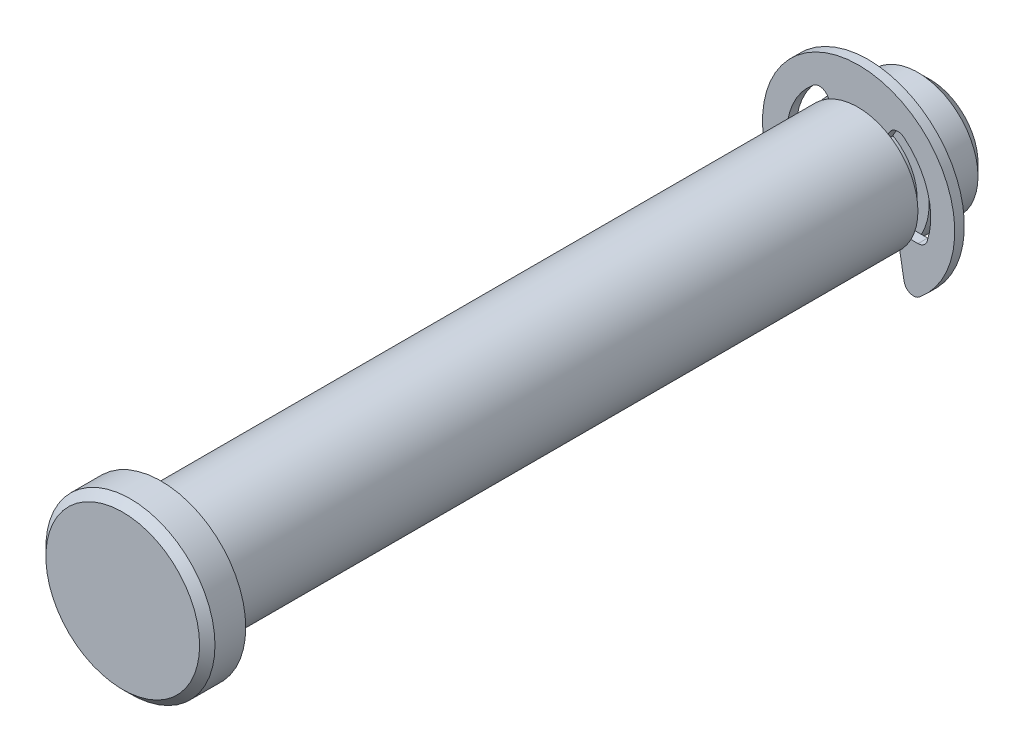
ISO-10303-21;
HEADER;
FILE_DESCRIPTION(('STEP AP214'),'2;1');
FILE_NAME('part.step','',(''),(''),'','','');
FILE_SCHEMA(('AUTOMOTIVE_DESIGN { 1 0 10303 214 1 1 1 1 }'));
ENDSEC;
DATA;
#1=APPLICATION_CONTEXT('core data for automotive mechanical design processes');
#2=APPLICATION_PROTOCOL_DEFINITION('international standard','automotive_design',2000,#1);
#3=PRODUCT_CONTEXT('',#1,'mechanical');
#4=PRODUCT('Part','Part','',(#3));
#5=PRODUCT_RELATED_PRODUCT_CATEGORY('part','',(#4));
#6=PRODUCT_DEFINITION_FORMATION('','',#4);
#7=PRODUCT_DEFINITION_CONTEXT('part definition',#1,'design');
#8=PRODUCT_DEFINITION('design','',#6,#7);
#9=PRODUCT_DEFINITION_SHAPE('','',#8);
#10=(LENGTH_UNIT() NAMED_UNIT(*) SI_UNIT(.MILLI.,.METRE.));
#11=(NAMED_UNIT(*) PLANE_ANGLE_UNIT() SI_UNIT($,.RADIAN.));
#12=(NAMED_UNIT(*) SI_UNIT($,.STERADIAN.) SOLID_ANGLE_UNIT());
#13=UNCERTAINTY_MEASURE_WITH_UNIT(LENGTH_MEASURE(1.E-05),#10,'distance_accuracy_value','');
#14=(GEOMETRIC_REPRESENTATION_CONTEXT(3) GLOBAL_UNCERTAINTY_ASSIGNED_CONTEXT((#13)) GLOBAL_UNIT_ASSIGNED_CONTEXT((#10,
#11,#12)) REPRESENTATION_CONTEXT('',''));
#15=CARTESIAN_POINT('',(0.,0.,0.));
#16=DIRECTION('',(0.,0.,1.));
#17=DIRECTION('',(1.,0.,0.));
#18=AXIS2_PLACEMENT_3D('',#15,#16,#17);
#19=CARTESIAN_POINT('',(0.,0.,-20.6883));
#20=DIRECTION('',(0.,0.,1.));
#21=DIRECTION('',(1.,0.,0.));
#22=AXIS2_PLACEMENT_3D('',#19,#20,#21);
#23=PLANE('',#22);
#24=DIRECTION('',(-0.173648177666931,0.984807753012208,0.));
#25=VECTOR('',#24,1.);
#26=CARTESIAN_POINT('',(2.1376354418804,0.376922803322178,-20.6883));
#27=LINE('',#26,#25);
#28=CARTESIAN_POINT('',(3.00221796143766,-4.52636832140214,-20.6883));
#29=VERTEX_POINT('',#28);
#30=CARTESIAN_POINT('',(2.54,-1.905,-20.6883));
#31=VERTEX_POINT('',#30);
#32=EDGE_CURVE('E200',#29,#31,#27,.T.);
#33=ORIENTED_EDGE('',*,*,#32,.F.);
#34=CARTESIAN_POINT('',(3.62757088460041,-4.41610172858364,-20.6883));
#35=DIRECTION('',(0.,0.,1.));
#36=DIRECTION('',(1.,0.,0.));
#37=AXIS2_PLACEMENT_3D('',#34,#35,#36);
#38=CIRCLE('',#37,0.635);
#39=CARTESIAN_POINT('',(4.03063431622268,-4.90677969842626,-20.6883));
#40=VERTEX_POINT('',#39);
#41=EDGE_CURVE('E254',#29,#40,#38,.T.);
#42=ORIENTED_EDGE('',*,*,#41,.T.);
#43=CARTESIAN_POINT('',(0.,0.,-20.6883));
#44=DIRECTION('',(0.,0.,1.));
#45=DIRECTION('',(1.,0.,0.));
#46=AXIS2_PLACEMENT_3D('',#43,#44,#45);
#47=CIRCLE('',#46,6.35);
#48=CARTESIAN_POINT('',(-4.03063431622268,-4.90677969842626,-20.6883));
#49=VERTEX_POINT('',#48);
#50=EDGE_CURVE('E180',#40,#49,#47,.T.);
#51=ORIENTED_EDGE('',*,*,#50,.T.);
#52=CARTESIAN_POINT('',(-3.62757088460041,-4.41610172858364,-20.6883));
#53=DIRECTION('',(0.,0.,1.));
#54=DIRECTION('',(1.,0.,0.));
#55=AXIS2_PLACEMENT_3D('',#52,#53,#54);
#56=CIRCLE('',#55,0.635);
#57=CARTESIAN_POINT('',(-3.00221796143766,-4.52636832140214,-20.6883));
#58=VERTEX_POINT('',#57);
#59=EDGE_CURVE('E252',#49,#58,#56,.T.);
#60=ORIENTED_EDGE('',*,*,#59,.T.);
#61=DIRECTION('',(-0.173648177666931,-0.984807753012208,0.));
#62=VECTOR('',#61,1.);
#63=CARTESIAN_POINT('',(-2.1376354418804,0.376922803322178,-20.6883));
#64=LINE('',#63,#62);
#65=CARTESIAN_POINT('',(-2.54,-1.905,-20.6883));
#66=VERTEX_POINT('',#65);
#67=EDGE_CURVE('E196',#66,#58,#64,.T.);
#68=ORIENTED_EDGE('',*,*,#67,.F.);
#69=DIRECTION('',(1.,0.,0.));
#70=VECTOR('',#69,1.);
#71=CARTESIAN_POINT('',(0.,-1.905,-20.6883));
#72=LINE('',#71,#70);
#73=CARTESIAN_POINT('',(-3.92725810840082,-1.905,-20.6883));
#74=VERTEX_POINT('',#73);
#75=EDGE_CURVE('E187',#74,#66,#72,.T.);
#76=ORIENTED_EDGE('',*,*,#75,.F.);
#77=CARTESIAN_POINT('',(-3.92725810840082,-1.27,-20.6883));
#78=DIRECTION('',(0.,0.,1.));
#79=DIRECTION('',(1.,0.,0.));
#80=AXIS2_PLACEMENT_3D('',#77,#78,#79);
#81=CIRCLE('',#80,0.635);
#82=CARTESIAN_POINT('',(-4.53145166353941,-1.46538461538462,-20.6883));
#83=VERTEX_POINT('',#82);
#84=EDGE_CURVE('E52',#74,#83,#81,.F.);
#85=ORIENTED_EDGE('',*,*,#84,.T.);
#86=CARTESIAN_POINT('',(0.,0.,-20.6883));
#87=DIRECTION('',(0.,0.,1.));
#88=DIRECTION('',(1.,0.,0.));
#89=AXIS2_PLACEMENT_3D('',#86,#87,#88);
#90=CIRCLE('',#89,4.7625);
#91=CARTESIAN_POINT('',(-2.98743092684563,3.70899753401458,-20.6883));
#92=VERTEX_POINT('',#91);
#93=EDGE_CURVE('E212',#92,#83,#90,.T.);
#94=ORIENTED_EDGE('',*,*,#93,.F.);
#95=CARTESIAN_POINT('',(-2.58910680326621,3.2144645294793,-20.6883));
#96=DIRECTION('',(0.,0.,1.));
#97=DIRECTION('',(1.,0.,0.));
#98=AXIS2_PLACEMENT_3D('',#95,#96,#97);
#99=CIRCLE('',#98,0.635);
#100=CARTESIAN_POINT('',(-2.0391806718631,3.53196452947931,-20.6883));
#101=VERTEX_POINT('',#100);
#102=EDGE_CURVE('E184',#92,#101,#99,.F.);
#103=ORIENTED_EDGE('',*,*,#102,.T.);
#104=DIRECTION('',(-0.500000000000002,0.866025403784438,0.));
#105=VECTOR('',#104,1.);
#106=CARTESIAN_POINT('',(0.,0.,-20.6883));
#107=LINE('',#106,#105);
#108=CARTESIAN_POINT('',(-1.5875,2.74963065701559,-20.6883));
#109=VERTEX_POINT('',#108);
#110=EDGE_CURVE('E176',#109,#101,#107,.T.);
#111=ORIENTED_EDGE('',*,*,#110,.F.);
#112=DIRECTION('',(1.,0.,0.));
#113=VECTOR('',#112,1.);
#114=CARTESIAN_POINT('',(-1.5875,2.74963065701559,-20.6883));
#115=LINE('',#114,#113);
#116=CARTESIAN_POINT('',(1.5875,2.74963065701559,-20.6883));
#117=VERTEX_POINT('',#116);
#118=EDGE_CURVE('E160',#109,#117,#115,.T.);
#119=ORIENTED_EDGE('',*,*,#118,.T.);
#120=DIRECTION('',(-0.500000000000002,-0.866025403784438,0.));
#121=VECTOR('',#120,1.);
#122=CARTESIAN_POINT('',(0.,0.,-20.6883));
#123=LINE('',#122,#121);
#124=CARTESIAN_POINT('',(2.0391806718631,3.53196452947931,-20.6883));
#125=VERTEX_POINT('',#124);
#126=EDGE_CURVE('E210',#125,#117,#123,.T.);
#127=ORIENTED_EDGE('',*,*,#126,.F.);
#128=CARTESIAN_POINT('',(2.58910680326621,3.2144645294793,-20.6883));
#129=DIRECTION('',(0.,0.,1.));
#130=DIRECTION('',(1.,0.,0.));
#131=AXIS2_PLACEMENT_3D('',#128,#129,#130);
#132=CIRCLE('',#131,0.635);
#133=CARTESIAN_POINT('',(2.98743092684563,3.70899753401458,-20.6883));
#134=VERTEX_POINT('',#133);
#135=EDGE_CURVE('E269',#125,#134,#132,.F.);
#136=ORIENTED_EDGE('',*,*,#135,.T.);
#137=CARTESIAN_POINT('',(0.,0.,-20.6883));
#138=DIRECTION('',(0.,0.,1.));
#139=DIRECTION('',(1.,0.,0.));
#140=AXIS2_PLACEMENT_3D('',#137,#138,#139);
#141=CIRCLE('',#140,4.7625);
#142=CARTESIAN_POINT('',(4.53145166353941,-1.46538461538462,-20.6883));
#143=VERTEX_POINT('',#142);
#144=EDGE_CURVE('E215',#143,#134,#141,.T.);
#145=ORIENTED_EDGE('',*,*,#144,.F.);
#146=CARTESIAN_POINT('',(3.92725810840082,-1.27,-20.6883));
#147=DIRECTION('',(0.,0.,1.));
#148=DIRECTION('',(1.,0.,0.));
#149=AXIS2_PLACEMENT_3D('',#146,#147,#148);
#150=CIRCLE('',#149,0.635);
#151=CARTESIAN_POINT('',(3.92725810840082,-1.905,-20.6883));
#152=VERTEX_POINT('',#151);
#153=EDGE_CURVE('E265',#143,#152,#150,.F.);
#154=ORIENTED_EDGE('',*,*,#153,.T.);
#155=DIRECTION('',(1.,0.,0.));
#156=VECTOR('',#155,1.);
#157=CARTESIAN_POINT('',(0.,-1.905,-20.6883));
#158=LINE('',#157,#156);
#159=EDGE_CURVE('E205',#31,#152,#158,.T.);
#160=ORIENTED_EDGE('',*,*,#159,.F.);
#161=EDGE_LOOP('',(#33,#42,#51,#60,#68,#76,#85,#94,#103,#111,#119,#127,#136,#145,#154,#160));
#162=FACE_BOUND('',#161,.T.);
#163=ADVANCED_FACE('F44',(#162),#23,.T.);
#164=CARTESIAN_POINT('',(0.,0.,-21.3233));
#165=DIRECTION('',(0.,0.,1.));
#166=DIRECTION('',(1.,0.,0.));
#167=AXIS2_PLACEMENT_3D('',#164,#165,#166);
#168=PLANE('',#167);
#169=CARTESIAN_POINT('',(0.,0.,-21.3233));
#170=DIRECTION('',(0.,0.,1.));
#171=DIRECTION('',(1.,0.,0.));
#172=AXIS2_PLACEMENT_3D('',#169,#170,#171);
#173=CIRCLE('',#172,6.35);
#174=CARTESIAN_POINT('',(4.03063431622268,-4.90677969842626,-21.3233));
#175=VERTEX_POINT('',#174);
#176=CARTESIAN_POINT('',(-4.03063431622268,-4.90677969842626,-21.3233));
#177=VERTEX_POINT('',#176);
#178=EDGE_CURVE('E218',#175,#177,#173,.T.);
#179=ORIENTED_EDGE('',*,*,#178,.F.);
#180=CARTESIAN_POINT('',(3.62757088460041,-4.41610172858364,-21.3233));
#181=DIRECTION('',(0.,0.,1.));
#182=DIRECTION('',(1.,0.,0.));
#183=AXIS2_PLACEMENT_3D('',#180,#181,#182);
#184=CIRCLE('',#183,0.635);
#185=CARTESIAN_POINT('',(3.00221796143766,-4.52636832140214,-21.3233));
#186=VERTEX_POINT('',#185);
#187=EDGE_CURVE('E262',#175,#186,#184,.F.);
#188=ORIENTED_EDGE('',*,*,#187,.T.);
#189=DIRECTION('',(-0.173648177666931,0.984807753012208,0.));
#190=VECTOR('',#189,1.);
#191=CARTESIAN_POINT('',(2.1376354418804,0.376922803322178,-21.3233));
#192=LINE('',#191,#190);
#193=CARTESIAN_POINT('',(2.54,-1.905,-21.3233));
#194=VERTEX_POINT('',#193);
#195=EDGE_CURVE('E198',#186,#194,#192,.T.);
#196=ORIENTED_EDGE('',*,*,#195,.T.);
#197=DIRECTION('',(1.,0.,0.));
#198=VECTOR('',#197,1.);
#199=CARTESIAN_POINT('',(0.,-1.905,-21.3233));
#200=LINE('',#199,#198);
#201=CARTESIAN_POINT('',(3.92725810840082,-1.905,-21.3233));
#202=VERTEX_POINT('',#201);
#203=EDGE_CURVE('E202',#194,#202,#200,.T.);
#204=ORIENTED_EDGE('',*,*,#203,.T.);
#205=CARTESIAN_POINT('',(3.92725810840082,-1.27,-21.3233));
#206=DIRECTION('',(0.,0.,1.));
#207=DIRECTION('',(1.,0.,0.));
#208=AXIS2_PLACEMENT_3D('',#205,#206,#207);
#209=CIRCLE('',#208,0.635);
#210=CARTESIAN_POINT('',(4.53145166353941,-1.46538461538462,-21.3233));
#211=VERTEX_POINT('',#210);
#212=EDGE_CURVE('E267',#202,#211,#209,.T.);
#213=ORIENTED_EDGE('',*,*,#212,.T.);
#214=CARTESIAN_POINT('',(0.,0.,-21.3233));
#215=DIRECTION('',(0.,0.,1.));
#216=DIRECTION('',(1.,0.,0.));
#217=AXIS2_PLACEMENT_3D('',#214,#215,#216);
#218=CIRCLE('',#217,4.7625);
#219=CARTESIAN_POINT('',(2.98743092684563,3.70899753401458,-21.3233));
#220=VERTEX_POINT('',#219);
#221=EDGE_CURVE('E226',#211,#220,#218,.T.);
#222=ORIENTED_EDGE('',*,*,#221,.T.);
#223=CARTESIAN_POINT('',(2.58910680326621,3.2144645294793,-21.3233));
#224=DIRECTION('',(0.,0.,1.));
#225=DIRECTION('',(1.,0.,0.));
#226=AXIS2_PLACEMENT_3D('',#223,#224,#225);
#227=CIRCLE('',#226,0.635);
#228=CARTESIAN_POINT('',(2.0391806718631,3.53196452947931,-21.3233));
#229=VERTEX_POINT('',#228);
#230=EDGE_CURVE('E271',#220,#229,#227,.T.);
#231=ORIENTED_EDGE('',*,*,#230,.T.);
#232=DIRECTION('',(-0.500000000000002,-0.866025403784438,0.));
#233=VECTOR('',#232,1.);
#234=CARTESIAN_POINT('',(0.,0.,-21.3233));
#235=LINE('',#234,#233);
#236=CARTESIAN_POINT('',(1.5875,2.74963065701559,-21.3233));
#237=VERTEX_POINT('',#236);
#238=EDGE_CURVE('E208',#229,#237,#235,.T.);
#239=ORIENTED_EDGE('',*,*,#238,.T.);
#240=DIRECTION('',(-1.,0.,0.));
#241=VECTOR('',#240,1.);
#242=CARTESIAN_POINT('',(-1.5875,2.74963065701559,-21.3233));
#243=LINE('',#242,#241);
#244=CARTESIAN_POINT('',(-1.5875,2.74963065701559,-21.3233));
#245=VERTEX_POINT('',#244);
#246=EDGE_CURVE('E171',#237,#245,#243,.T.);
#247=ORIENTED_EDGE('',*,*,#246,.T.);
#248=DIRECTION('',(-0.500000000000002,0.866025403784438,0.));
#249=VECTOR('',#248,1.);
#250=CARTESIAN_POINT('',(0.,0.,-21.3233));
#251=LINE('',#250,#249);
#252=CARTESIAN_POINT('',(-2.0391806718631,3.53196452947931,-21.3233));
#253=VERTEX_POINT('',#252);
#254=EDGE_CURVE('E179',#245,#253,#251,.T.);
#255=ORIENTED_EDGE('',*,*,#254,.T.);
#256=CARTESIAN_POINT('',(-2.58910680326621,3.2144645294793,-21.3233));
#257=DIRECTION('',(0.,0.,1.));
#258=DIRECTION('',(1.,0.,0.));
#259=AXIS2_PLACEMENT_3D('',#256,#257,#258);
#260=CIRCLE('',#259,0.635);
#261=CARTESIAN_POINT('',(-2.98743092684563,3.70899753401458,-21.3233));
#262=VERTEX_POINT('',#261);
#263=EDGE_CURVE('E274',#253,#262,#260,.T.);
#264=ORIENTED_EDGE('',*,*,#263,.T.);
#265=CARTESIAN_POINT('',(0.,0.,-21.3233));
#266=DIRECTION('',(0.,0.,1.));
#267=DIRECTION('',(1.,0.,0.));
#268=AXIS2_PLACEMENT_3D('',#265,#266,#267);
#269=CIRCLE('',#268,4.7625);
#270=CARTESIAN_POINT('',(-4.53145166353941,-1.46538461538462,-21.3233));
#271=VERTEX_POINT('',#270);
#272=EDGE_CURVE('E223',#262,#271,#269,.T.);
#273=ORIENTED_EDGE('',*,*,#272,.T.);
#274=CARTESIAN_POINT('',(-3.92725810840082,-1.27,-21.3233));
#275=DIRECTION('',(0.,0.,1.));
#276=DIRECTION('',(1.,0.,0.));
#277=AXIS2_PLACEMENT_3D('',#274,#275,#276);
#278=CIRCLE('',#277,0.635);
#279=CARTESIAN_POINT('',(-3.92725810840082,-1.905,-21.3233));
#280=VERTEX_POINT('',#279);
#281=EDGE_CURVE('E12',#271,#280,#278,.T.);
#282=ORIENTED_EDGE('',*,*,#281,.T.);
#283=DIRECTION('',(1.,0.,0.));
#284=VECTOR('',#283,1.);
#285=CARTESIAN_POINT('',(0.,-1.905,-21.3233));
#286=LINE('',#285,#284);
#287=CARTESIAN_POINT('',(-2.54,-1.905,-21.3233));
#288=VERTEX_POINT('',#287);
#289=EDGE_CURVE('E185',#280,#288,#286,.T.);
#290=ORIENTED_EDGE('',*,*,#289,.T.);
#291=DIRECTION('',(-0.173648177666931,-0.984807753012208,0.));
#292=VECTOR('',#291,1.);
#293=CARTESIAN_POINT('',(-2.1376354418804,0.376922803322178,-21.3233));
#294=LINE('',#293,#292);
#295=CARTESIAN_POINT('',(-3.00221796143766,-4.52636832140214,-21.3233));
#296=VERTEX_POINT('',#295);
#297=EDGE_CURVE('E194',#288,#296,#294,.T.);
#298=ORIENTED_EDGE('',*,*,#297,.T.);
#299=CARTESIAN_POINT('',(-3.62757088460041,-4.41610172858364,-21.3233));
#300=DIRECTION('',(0.,0.,1.));
#301=DIRECTION('',(1.,0.,0.));
#302=AXIS2_PLACEMENT_3D('',#299,#300,#301);
#303=CIRCLE('',#302,0.635);
#304=EDGE_CURVE('E66',#296,#177,#303,.F.);
#305=ORIENTED_EDGE('',*,*,#304,.T.);
#306=EDGE_LOOP('',(#179,#188,#196,#204,#213,#222,#231,#239,#247,#255,#264,#273,#282,#290,#298,#305));
#307=FACE_BOUND('',#306,.T.);
#308=ADVANCED_FACE('F287',(#307),#168,.F.);
#309=CARTESIAN_POINT('',(0.,0.,-20.6883));
#310=DIRECTION('',(0.,0.,-1.));
#311=DIRECTION('',(-1.,0.,0.));
#312=AXIS2_PLACEMENT_3D('',#309,#310,#311);
#313=CYLINDRICAL_SURFACE('',#312,6.35);
#314=ORIENTED_EDGE('',*,*,#50,.F.);
#315=DIRECTION('',(0.,0.,-1.));
#316=VECTOR('',#315,1.);
#317=CARTESIAN_POINT('',(4.03063431622268,-4.90677969842626,-20.6883));
#318=LINE('',#317,#316);
#319=EDGE_CURVE('E259',#40,#175,#318,.T.);
#320=ORIENTED_EDGE('',*,*,#319,.T.);
#321=ORIENTED_EDGE('',*,*,#178,.T.);
#322=DIRECTION('',(0.,0.,-1.));
#323=VECTOR('',#322,1.);
#324=CARTESIAN_POINT('',(-4.03063431622268,-4.90677969842626,-20.6883));
#325=LINE('',#324,#323);
#326=EDGE_CURVE('E256',#177,#49,#325,.F.);
#327=ORIENTED_EDGE('',*,*,#326,.T.);
#328=EDGE_LOOP('',(#314,#320,#321,#327));
#329=FACE_BOUND('',#328,.T.);
#330=ADVANCED_FACE('F327',(#329),#313,.T.);
#331=CARTESIAN_POINT('',(-2.54,-1.905,-25.4));
#332=DIRECTION('',(-0.984807753012208,0.173648177666931,0.));
#333=DIRECTION('',(-0.173648177666931,-0.984807753012208,0.));
#334=AXIS2_PLACEMENT_3D('',#331,#332,#333);
#335=PLANE('',#334);
#336=ORIENTED_EDGE('',*,*,#67,.T.);
#337=DIRECTION('',(0.,0.,-1.));
#338=VECTOR('',#337,1.);
#339=CARTESIAN_POINT('',(-3.00221796143766,-4.52636832140214,-25.4));
#340=LINE('',#339,#338);
#341=EDGE_CURVE('E59',#58,#296,#340,.T.);
#342=ORIENTED_EDGE('',*,*,#341,.T.);
#343=ORIENTED_EDGE('',*,*,#297,.F.);
#344=DIRECTION('',(0.,0.,1.));
#345=VECTOR('',#344,1.);
#346=CARTESIAN_POINT('',(-2.54,-1.905,-25.4));
#347=LINE('',#346,#345);
#348=EDGE_CURVE('E292',#288,#66,#347,.T.);
#349=ORIENTED_EDGE('',*,*,#348,.T.);
#350=EDGE_LOOP('',(#336,#342,#343,#349));
#351=FACE_BOUND('',#350,.T.);
#352=ADVANCED_FACE('F332',(#351),#335,.F.);
#353=CARTESIAN_POINT('',(-2.38125000000001,4.12444598552338,-25.4));
#354=DIRECTION('',(0.866025403784438,0.500000000000001,0.));
#355=DIRECTION('',(-0.500000000000002,0.866025403784438,0.));
#356=AXIS2_PLACEMENT_3D('',#353,#354,#355);
#357=PLANE('',#356);
#358=ORIENTED_EDGE('',*,*,#110,.T.);
#359=DIRECTION('',(0.,0.,-1.));
#360=VECTOR('',#359,1.);
#361=CARTESIAN_POINT('',(-2.03918067186309,3.5319645294793,-21.3233));
#362=LINE('',#361,#360);
#363=EDGE_CURVE('E244',#101,#253,#362,.T.);
#364=ORIENTED_EDGE('',*,*,#363,.T.);
#365=ORIENTED_EDGE('',*,*,#254,.F.);
#366=DIRECTION('',(0.,0.,-1.));
#367=VECTOR('',#366,1.);
#368=CARTESIAN_POINT('',(-1.5875,2.74963065701559,-20.6883));
#369=LINE('',#368,#367);
#370=EDGE_CURVE('E164',#245,#109,#369,.F.);
#371=ORIENTED_EDGE('',*,*,#370,.T.);
#372=EDGE_LOOP('',(#358,#364,#365,#371));
#373=FACE_BOUND('',#372,.T.);
#374=ADVANCED_FACE('F175',(#373),#357,.F.);
#375=CARTESIAN_POINT('',(0.,0.,-25.4));
#376=DIRECTION('',(0.,0.,1.));
#377=DIRECTION('',(1.,0.,0.));
#378=AXIS2_PLACEMENT_3D('',#375,#376,#377);
#379=CYLINDRICAL_SURFACE('',#378,4.7625);
#380=ORIENTED_EDGE('',*,*,#272,.F.);
#381=DIRECTION('',(0.,0.,1.));
#382=VECTOR('',#381,1.);
#383=CARTESIAN_POINT('',(-2.98743092684563,3.70899753401458,-25.4));
#384=LINE('',#383,#382);
#385=EDGE_CURVE('E241',#262,#92,#384,.T.);
#386=ORIENTED_EDGE('',*,*,#385,.T.);
#387=ORIENTED_EDGE('',*,*,#93,.T.);
#388=DIRECTION('',(0.,0.,1.));
#389=VECTOR('',#388,1.);
#390=CARTESIAN_POINT('',(-4.53145166353941,-1.46538461538462,-25.4));
#391=LINE('',#390,#389);
#392=EDGE_CURVE('E239',#83,#271,#391,.F.);
#393=ORIENTED_EDGE('',*,*,#392,.T.);
#394=EDGE_LOOP('',(#380,#386,#387,#393));
#395=FACE_BOUND('',#394,.T.);
#396=ADVANCED_FACE('F282',(#395),#379,.F.);
#397=CARTESIAN_POINT('',(-4.36490334944544,-1.905,-25.4));
#398=DIRECTION('',(0.,-1.,0.));
#399=DIRECTION('',(0.,0.,-1.));
#400=AXIS2_PLACEMENT_3D('',#397,#398,#399);
#401=PLANE('',#400);
#402=ORIENTED_EDGE('',*,*,#289,.F.);
#403=DIRECTION('',(0.,0.,-1.));
#404=VECTOR('',#403,1.);
#405=CARTESIAN_POINT('',(-3.92725810840082,-1.905,-20.6883));
#406=LINE('',#405,#404);
#407=EDGE_CURVE('E246',#280,#74,#406,.F.);
#408=ORIENTED_EDGE('',*,*,#407,.T.);
#409=ORIENTED_EDGE('',*,*,#75,.T.);
#410=ORIENTED_EDGE('',*,*,#348,.F.);
#411=EDGE_LOOP('',(#402,#408,#409,#410));
#412=FACE_BOUND('',#411,.T.);
#413=ADVANCED_FACE('F290',(#412),#401,.F.);
#414=CARTESIAN_POINT('',(0.,0.,-25.4));
#415=DIRECTION('',(0.,0.,1.));
#416=DIRECTION('',(1.,0.,0.));
#417=AXIS2_PLACEMENT_3D('',#414,#415,#416);
#418=CYLINDRICAL_SURFACE('',#417,4.7625);
#419=ORIENTED_EDGE('',*,*,#221,.F.);
#420=DIRECTION('',(0.,0.,1.));
#421=VECTOR('',#420,1.);
#422=CARTESIAN_POINT('',(4.53145166353941,-1.46538461538462,-25.4));
#423=LINE('',#422,#421);
#424=EDGE_CURVE('E231',#211,#143,#423,.T.);
#425=ORIENTED_EDGE('',*,*,#424,.T.);
#426=ORIENTED_EDGE('',*,*,#144,.T.);
#427=DIRECTION('',(0.,0.,1.));
#428=VECTOR('',#427,1.);
#429=CARTESIAN_POINT('',(2.98743092684563,3.70899753401458,-25.4));
#430=LINE('',#429,#428);
#431=EDGE_CURVE('E229',#134,#220,#430,.F.);
#432=ORIENTED_EDGE('',*,*,#431,.T.);
#433=EDGE_LOOP('',(#419,#425,#426,#432));
#434=FACE_BOUND('',#433,.T.);
#435=ADVANCED_FACE('F306',(#434),#418,.F.);
#436=CARTESIAN_POINT('',(2.54,-1.905,-25.4));
#437=DIRECTION('',(0.,-1.,0.));
#438=DIRECTION('',(0.,0.,-1.));
#439=AXIS2_PLACEMENT_3D('',#436,#437,#438);
#440=PLANE('',#439);
#441=ORIENTED_EDGE('',*,*,#159,.T.);
#442=DIRECTION('',(0.,0.,-1.));
#443=VECTOR('',#442,1.);
#444=CARTESIAN_POINT('',(3.92725810840082,-1.905,-21.3233));
#445=LINE('',#444,#443);
#446=EDGE_CURVE('E234',#152,#202,#445,.T.);
#447=ORIENTED_EDGE('',*,*,#446,.T.);
#448=ORIENTED_EDGE('',*,*,#203,.F.);
#449=DIRECTION('',(0.,0.,1.));
#450=VECTOR('',#449,1.);
#451=CARTESIAN_POINT('',(2.54,-1.905,-25.4));
#452=LINE('',#451,#450);
#453=EDGE_CURVE('E189',#194,#31,#452,.T.);
#454=ORIENTED_EDGE('',*,*,#453,.T.);
#455=EDGE_LOOP('',(#441,#447,#448,#454));
#456=FACE_BOUND('',#455,.T.);
#457=ADVANCED_FACE('F316',(#456),#440,.F.);
#458=CARTESIAN_POINT('',(2.54,-1.905,-25.4));
#459=DIRECTION('',(0.984807753012208,0.173648177666931,0.));
#460=DIRECTION('',(-0.173648177666931,0.984807753012208,0.));
#461=AXIS2_PLACEMENT_3D('',#458,#459,#460);
#462=PLANE('',#461);
#463=ORIENTED_EDGE('',*,*,#195,.F.);
#464=DIRECTION('',(0.,0.,-1.));
#465=VECTOR('',#464,1.);
#466=CARTESIAN_POINT('',(3.00221796143766,-4.52636832140214,-25.4));
#467=LINE('',#466,#465);
#468=EDGE_CURVE('E249',#186,#29,#467,.F.);
#469=ORIENTED_EDGE('',*,*,#468,.T.);
#470=ORIENTED_EDGE('',*,*,#32,.T.);
#471=ORIENTED_EDGE('',*,*,#453,.F.);
#472=EDGE_LOOP('',(#463,#469,#470,#471));
#473=FACE_BOUND('',#472,.T.);
#474=ADVANCED_FACE('F321',(#473),#462,.F.);
#475=CARTESIAN_POINT('',(0.,0.,-25.4));
#476=DIRECTION('',(-0.866025403784438,0.500000000000001,0.));
#477=DIRECTION('',(-0.500000000000002,-0.866025403784438,0.));
#478=AXIS2_PLACEMENT_3D('',#475,#476,#477);
#479=PLANE('',#478);
#480=ORIENTED_EDGE('',*,*,#238,.F.);
#481=DIRECTION('',(0.,0.,-1.));
#482=VECTOR('',#481,1.);
#483=CARTESIAN_POINT('',(2.03918067186309,3.5319645294793,-20.6883));
#484=LINE('',#483,#482);
#485=EDGE_CURVE('E236',#229,#125,#484,.F.);
#486=ORIENTED_EDGE('',*,*,#485,.T.);
#487=ORIENTED_EDGE('',*,*,#126,.T.);
#488=DIRECTION('',(0.,0.,-1.));
#489=VECTOR('',#488,1.);
#490=CARTESIAN_POINT('',(1.5875,2.74963065701559,-20.6883));
#491=LINE('',#490,#489);
#492=EDGE_CURVE('E167',#117,#237,#491,.T.);
#493=ORIENTED_EDGE('',*,*,#492,.T.);
#494=EDGE_LOOP('',(#480,#486,#487,#493));
#495=FACE_BOUND('',#494,.T.);
#496=ADVANCED_FACE('F299',(#495),#479,.F.);
#497=CARTESIAN_POINT('',(-1.5875,2.74963065701559,-24.5266676151749));
#498=DIRECTION('',(0.,-1.,0.));
#499=DIRECTION('',(0.,0.,-1.));
#500=AXIS2_PLACEMENT_3D('',#497,#498,#499);
#501=PLANE('',#500);
#502=ORIENTED_EDGE('',*,*,#246,.F.);
#503=ORIENTED_EDGE('',*,*,#492,.F.);
#504=ORIENTED_EDGE('',*,*,#118,.F.);
#505=ORIENTED_EDGE('',*,*,#370,.F.);
#506=EDGE_LOOP('',(#502,#503,#504,#505));
#507=FACE_BOUND('',#506,.T.);
#508=ADVANCED_FACE('F163',(#507),#501,.T.);
#509=CARTESIAN_POINT('',(3.92725810840082,-1.27,-25.4));
#510=DIRECTION('',(0.,0.,1.));
#511=DIRECTION('',(1.,0.,0.));
#512=AXIS2_PLACEMENT_3D('',#509,#510,#511);
#513=CYLINDRICAL_SURFACE('',#512,0.635);
#514=ORIENTED_EDGE('',*,*,#212,.F.);
#515=ORIENTED_EDGE('',*,*,#446,.F.);
#516=ORIENTED_EDGE('',*,*,#153,.F.);
#517=ORIENTED_EDGE('',*,*,#424,.F.);
#518=EDGE_LOOP('',(#514,#515,#516,#517));
#519=FACE_BOUND('',#518,.T.);
#520=ADVANCED_FACE('F312',(#519),#513,.F.);
#521=CARTESIAN_POINT('',(2.58910680326621,3.2144645294793,-25.4));
#522=DIRECTION('',(0.,0.,1.));
#523=DIRECTION('',(1.,0.,0.));
#524=AXIS2_PLACEMENT_3D('',#521,#522,#523);
#525=CYLINDRICAL_SURFACE('',#524,0.635);
#526=ORIENTED_EDGE('',*,*,#230,.F.);
#527=ORIENTED_EDGE('',*,*,#431,.F.);
#528=ORIENTED_EDGE('',*,*,#135,.F.);
#529=ORIENTED_EDGE('',*,*,#485,.F.);
#530=EDGE_LOOP('',(#526,#527,#528,#529));
#531=FACE_BOUND('',#530,.T.);
#532=ADVANCED_FACE('F309',(#531),#525,.F.);
#533=CARTESIAN_POINT('',(-2.58910680326621,3.2144645294793,-25.4));
#534=DIRECTION('',(0.,0.,1.));
#535=DIRECTION('',(1.,0.,0.));
#536=AXIS2_PLACEMENT_3D('',#533,#534,#535);
#537=CYLINDRICAL_SURFACE('',#536,0.635);
#538=ORIENTED_EDGE('',*,*,#263,.F.);
#539=ORIENTED_EDGE('',*,*,#363,.F.);
#540=ORIENTED_EDGE('',*,*,#102,.F.);
#541=ORIENTED_EDGE('',*,*,#385,.F.);
#542=EDGE_LOOP('',(#538,#539,#540,#541));
#543=FACE_BOUND('',#542,.T.);
#544=ADVANCED_FACE('F355',(#543),#537,.F.);
#545=CARTESIAN_POINT('',(-3.92725810840082,-1.27,-25.4));
#546=DIRECTION('',(0.,0.,1.));
#547=DIRECTION('',(1.,0.,0.));
#548=AXIS2_PLACEMENT_3D('',#545,#546,#547);
#549=CYLINDRICAL_SURFACE('',#548,0.635);
#550=ORIENTED_EDGE('',*,*,#281,.F.);
#551=ORIENTED_EDGE('',*,*,#392,.F.);
#552=ORIENTED_EDGE('',*,*,#84,.F.);
#553=ORIENTED_EDGE('',*,*,#407,.F.);
#554=EDGE_LOOP('',(#550,#551,#552,#553));
#555=FACE_BOUND('',#554,.T.);
#556=ADVANCED_FACE('F285',(#555),#549,.F.);
#557=CARTESIAN_POINT('',(3.62757088460041,-4.41610172858364,-20.6883));
#558=DIRECTION('',(0.,0.,-1.));
#559=DIRECTION('',(-1.,0.,0.));
#560=AXIS2_PLACEMENT_3D('',#557,#558,#559);
#561=CYLINDRICAL_SURFACE('',#560,0.635);
#562=ORIENTED_EDGE('',*,*,#187,.F.);
#563=ORIENTED_EDGE('',*,*,#319,.F.);
#564=ORIENTED_EDGE('',*,*,#41,.F.);
#565=ORIENTED_EDGE('',*,*,#468,.F.);
#566=EDGE_LOOP('',(#562,#563,#564,#565));
#567=FACE_BOUND('',#566,.T.);
#568=ADVANCED_FACE('F330',(#567),#561,.T.);
#569=CARTESIAN_POINT('',(-3.62757088460041,-4.41610172858364,-20.6883));
#570=DIRECTION('',(0.,0.,-1.));
#571=DIRECTION('',(-1.,0.,0.));
#572=AXIS2_PLACEMENT_3D('',#569,#570,#571);
#573=CYLINDRICAL_SURFACE('',#572,0.635);
#574=ORIENTED_EDGE('',*,*,#304,.F.);
#575=ORIENTED_EDGE('',*,*,#341,.F.);
#576=ORIENTED_EDGE('',*,*,#59,.F.);
#577=ORIENTED_EDGE('',*,*,#326,.F.);
#578=EDGE_LOOP('',(#574,#575,#576,#577));
#579=FACE_BOUND('',#578,.T.);
#580=ADVANCED_FACE('F46',(#579),#573,.T.);
#581=CLOSED_SHELL('',(#163,#308,#330,#352,#374,#396,#413,#435,#457,#474,#496,#508,#520,#532,
#544,#556,#568,#580));
#582=MANIFOLD_SOLID_BREP('B2',#581);
#583=CARTESIAN_POINT('',(0.,0.,25.4));
#584=DIRECTION('',(0.,0.,-1.));
#585=DIRECTION('',(-1.,0.,0.));
#586=AXIS2_PLACEMENT_3D('',#583,#584,#585);
#587=CYLINDRICAL_SURFACE('',#586,3.96875);
#588=CARTESIAN_POINT('',(0.,0.,25.4));
#589=DIRECTION('',(0.,0.,1.));
#590=DIRECTION('',(1.,0.,0.));
#591=AXIS2_PLACEMENT_3D('',#588,#589,#590);
#592=CIRCLE('',#591,3.96875);
#593=CARTESIAN_POINT('',(3.96875,0.,25.4));
#594=VERTEX_POINT('',#593);
#595=EDGE_CURVE('E505',#594,#594,#592,.T.);
#596=ORIENTED_EDGE('',*,*,#595,.F.);
#597=EDGE_LOOP('',(#596));
#598=FACE_BOUND('',#597,.T.);
#599=CARTESIAN_POINT('',(0.,0.,-20.6375));
#600=DIRECTION('',(0.,0.,1.));
#601=DIRECTION('',(1.,0.,0.));
#602=AXIS2_PLACEMENT_3D('',#599,#600,#601);
#603=CIRCLE('',#602,3.96875);
#604=CARTESIAN_POINT('',(3.96875,0.,-20.6375));
#605=VERTEX_POINT('',#604);
#606=EDGE_CURVE('E517',#605,#605,#603,.T.);
#607=ORIENTED_EDGE('',*,*,#606,.T.);
#608=EDGE_LOOP('',(#607));
#609=FACE_BOUND('',#608,.T.);
#610=ADVANCED_FACE('F485',(#598,#609),#587,.T.);
#611=CARTESIAN_POINT('',(0.,3.96875,-20.6375));
#612=DIRECTION('',(0.,0.,-1.));
#613=DIRECTION('',(-1.,0.,0.));
#614=AXIS2_PLACEMENT_3D('',#611,#612,#613);
#615=PLANE('',#614);
#616=CARTESIAN_POINT('',(0.,0.,-20.6375));
#617=DIRECTION('',(0.,0.,1.));
#618=DIRECTION('',(1.,0.,0.));
#619=AXIS2_PLACEMENT_3D('',#616,#617,#618);
#620=CIRCLE('',#619,3.175);
#621=CARTESIAN_POINT('',(3.175,0.,-20.6375));
#622=VERTEX_POINT('',#621);
#623=EDGE_CURVE('E508',#622,#622,#620,.T.);
#624=ORIENTED_EDGE('',*,*,#623,.T.);
#625=EDGE_LOOP('',(#624));
#626=FACE_BOUND('',#625,.T.);
#627=ORIENTED_EDGE('',*,*,#606,.F.);
#628=EDGE_LOOP('',(#627));
#629=FACE_BOUND('',#628,.T.);
#630=ADVANCED_FACE('F535',(#626,#629),#615,.T.);
#631=CARTESIAN_POINT('',(0.,0.,25.4));
#632=DIRECTION('',(0.,0.,1.));
#633=DIRECTION('',(1.,0.,0.));
#634=AXIS2_PLACEMENT_3D('',#631,#632,#633);
#635=CYLINDRICAL_SURFACE('',#634,3.175);
#636=CARTESIAN_POINT('',(0.,0.,-21.3741));
#637=DIRECTION('',(0.,0.,1.));
#638=DIRECTION('',(1.,0.,0.));
#639=AXIS2_PLACEMENT_3D('',#636,#637,#638);
#640=CIRCLE('',#639,3.175);
#641=CARTESIAN_POINT('',(3.175,0.,-21.3741));
#642=VERTEX_POINT('',#641);
#643=EDGE_CURVE('E511',#642,#642,#640,.T.);
#644=ORIENTED_EDGE('',*,*,#643,.T.);
#645=EDGE_LOOP('',(#644));
#646=FACE_BOUND('',#645,.T.);
#647=ORIENTED_EDGE('',*,*,#623,.F.);
#648=EDGE_LOOP('',(#647));
#649=FACE_BOUND('',#648,.T.);
#650=ADVANCED_FACE('F540',(#646,#649),#635,.T.);
#651=CARTESIAN_POINT('',(0.,3.96875,-21.3741));
#652=DIRECTION('',(0.,0.,1.));
#653=DIRECTION('',(1.,0.,0.));
#654=AXIS2_PLACEMENT_3D('',#651,#652,#653);
#655=PLANE('',#654);
#656=CARTESIAN_POINT('',(0.,0.,-21.3741));
#657=DIRECTION('',(0.,0.,1.));
#658=DIRECTION('',(1.,0.,0.));
#659=AXIS2_PLACEMENT_3D('',#656,#657,#658);
#660=CIRCLE('',#659,3.96875);
#661=CARTESIAN_POINT('',(3.96875,0.,-21.3741));
#662=VERTEX_POINT('',#661);
#663=EDGE_CURVE('E514',#662,#662,#660,.T.);
#664=ORIENTED_EDGE('',*,*,#663,.T.);
#665=EDGE_LOOP('',(#664));
#666=FACE_BOUND('',#665,.T.);
#667=ORIENTED_EDGE('',*,*,#643,.F.);
#668=EDGE_LOOP('',(#667));
#669=FACE_BOUND('',#668,.T.);
#670=ADVANCED_FACE('F546',(#666,#669),#655,.T.);
#671=CARTESIAN_POINT('',(0.,0.,-25.4));
#672=DIRECTION('',(0.,0.,1.));
#673=DIRECTION('',(1.,0.,0.));
#674=AXIS2_PLACEMENT_3D('',#671,#672,#673);
#675=PLANE('',#674);
#676=CARTESIAN_POINT('',(0.,0.,-25.4));
#677=DIRECTION('',(0.,0.,1.));
#678=DIRECTION('',(1.,0.,0.));
#679=AXIS2_PLACEMENT_3D('',#676,#677,#678);
#680=CIRCLE('',#679,3.17500000000001);
#681=CARTESIAN_POINT('',(3.17500000000001,0.,-25.4));
#682=VERTEX_POINT('',#681);
#683=EDGE_CURVE('E43',#682,#682,#680,.F.);
#684=ORIENTED_EDGE('',*,*,#683,.T.);
#685=EDGE_LOOP('',(#684));
#686=FACE_BOUND('',#685,.T.);
#687=ADVANCED_FACE('F551',(#686),#675,.F.);
#688=CARTESIAN_POINT('',(0.,0.,-24.60625));
#689=DIRECTION('',(0.,0.,1.));
#690=DIRECTION('',(1.,0.,0.));
#691=AXIS2_PLACEMENT_3D('',#688,#689,#690);
#692=CIRCLE('',#691,3.96875);
#693=CARTESIAN_POINT('',(3.96875,0.,-24.60625));
#694=VERTEX_POINT('',#693);
#695=EDGE_CURVE('E492',#694,#694,#692,.T.);
#696=ORIENTED_EDGE('',*,*,#695,.T.);
#697=EDGE_LOOP('',(#696));
#698=FACE_BOUND('',#697,.T.);
#699=ORIENTED_EDGE('',*,*,#663,.F.);
#700=EDGE_LOOP('',(#699));
#701=FACE_BOUND('',#700,.T.);
#702=ADVANCED_FACE('F529',(#698,#701),#587,.T.);
#703=CARTESIAN_POINT('',(0.,0.,25.4));
#704=DIRECTION('',(0.,0.,1.));
#705=DIRECTION('',(1.,0.,0.));
#706=AXIS2_PLACEMENT_3D('',#703,#704,#705);
#707=PLANE('',#706);
#708=CARTESIAN_POINT('',(0.,0.,25.4));
#709=DIRECTION('',(0.,0.,1.));
#710=DIRECTION('',(1.,0.,0.));
#711=AXIS2_PLACEMENT_3D('',#708,#709,#710);
#712=CIRCLE('',#711,5.588);
#713=CARTESIAN_POINT('',(5.588,0.,25.4));
#714=VERTEX_POINT('',#713);
#715=EDGE_CURVE('E520',#714,#714,#712,.T.);
#716=ORIENTED_EDGE('',*,*,#715,.F.);
#717=EDGE_LOOP('',(#716));
#718=FACE_BOUND('',#717,.T.);
#719=ORIENTED_EDGE('',*,*,#595,.T.);
#720=EDGE_LOOP('',(#719));
#721=FACE_BOUND('',#720,.T.);
#722=ADVANCED_FACE('F526',(#718,#721),#707,.F.);
#723=CARTESIAN_POINT('',(0.,0.,27.94));
#724=DIRECTION('',(0.,0.,-1.));
#725=DIRECTION('',(-1.,0.,0.));
#726=AXIS2_PLACEMENT_3D('',#723,#724,#725);
#727=CYLINDRICAL_SURFACE('',#726,5.588);
#728=CARTESIAN_POINT('',(0.,0.,27.432));
#729=DIRECTION('',(0.,0.,1.));
#730=DIRECTION('',(1.,0.,0.));
#731=AXIS2_PLACEMENT_3D('',#728,#729,#730);
#732=CIRCLE('',#731,5.588);
#733=CARTESIAN_POINT('',(5.588,0.,27.432));
#734=VERTEX_POINT('',#733);
#735=EDGE_CURVE('E496',#734,#734,#732,.F.);
#736=ORIENTED_EDGE('',*,*,#735,.T.);
#737=EDGE_LOOP('',(#736));
#738=FACE_BOUND('',#737,.T.);
#739=ORIENTED_EDGE('',*,*,#715,.T.);
#740=EDGE_LOOP('',(#739));
#741=FACE_BOUND('',#740,.T.);
#742=ADVANCED_FACE('F524',(#738,#741),#727,.T.);
#743=CARTESIAN_POINT('',(0.,0.,27.94));
#744=DIRECTION('',(0.,0.,1.));
#745=DIRECTION('',(1.,0.,0.));
#746=AXIS2_PLACEMENT_3D('',#743,#744,#745);
#747=PLANE('',#746);
#748=CARTESIAN_POINT('',(0.,0.,27.94));
#749=DIRECTION('',(0.,0.,1.));
#750=DIRECTION('',(1.,0.,0.));
#751=AXIS2_PLACEMENT_3D('',#748,#749,#750);
#752=CIRCLE('',#751,5.07999999999999);
#753=CARTESIAN_POINT('',(5.07999999999999,0.,27.94));
#754=VERTEX_POINT('',#753);
#755=EDGE_CURVE('E500',#754,#754,#752,.T.);
#756=ORIENTED_EDGE('',*,*,#755,.T.);
#757=EDGE_LOOP('',(#756));
#758=FACE_BOUND('',#757,.T.);
#759=ADVANCED_FACE('F555',(#758),#747,.T.);
#760=CARTESIAN_POINT('',(0.,0.,27.94));
#761=DIRECTION('',(0.,0.,-1.));
#762=DIRECTION('',(-1.,0.,0.));
#763=AXIS2_PLACEMENT_3D('',#760,#761,#762);
#764=CONICAL_SURFACE('',#763,5.07999999999999,0.785398163397442);
#765=ORIENTED_EDGE('',*,*,#735,.F.);
#766=EDGE_LOOP('',(#765));
#767=FACE_BOUND('',#766,.T.);
#768=ORIENTED_EDGE('',*,*,#755,.F.);
#769=EDGE_LOOP('',(#768));
#770=FACE_BOUND('',#769,.T.);
#771=ADVANCED_FACE('F553',(#767,#770),#764,.T.);
#772=CARTESIAN_POINT('',(0.,0.,-24.60625));
#773=DIRECTION('',(0.,0.,1.));
#774=DIRECTION('',(1.,0.,0.));
#775=AXIS2_PLACEMENT_3D('',#772,#773,#774);
#776=CONICAL_SURFACE('',#775,3.96875,0.785398163397448);
#777=ORIENTED_EDGE('',*,*,#683,.F.);
#778=EDGE_LOOP('',(#777));
#779=FACE_BOUND('',#778,.T.);
#780=ORIENTED_EDGE('',*,*,#695,.F.);
#781=EDGE_LOOP('',(#780));
#782=FACE_BOUND('',#781,.T.);
#783=ADVANCED_FACE('F487',(#779,#782),#776,.T.);
#784=CLOSED_SHELL('',(#610,#630,#650,#670,#687,#702,#722,#742,#759,#771,#783));
#785=MANIFOLD_SOLID_BREP('B6',#784);
#786=ADVANCED_BREP_SHAPE_REPRESENTATION('',(#18,#582,#785),#14);
#787=SHAPE_DEFINITION_REPRESENTATION(#9,#786);
ENDSEC;
END-ISO-10303-21;
